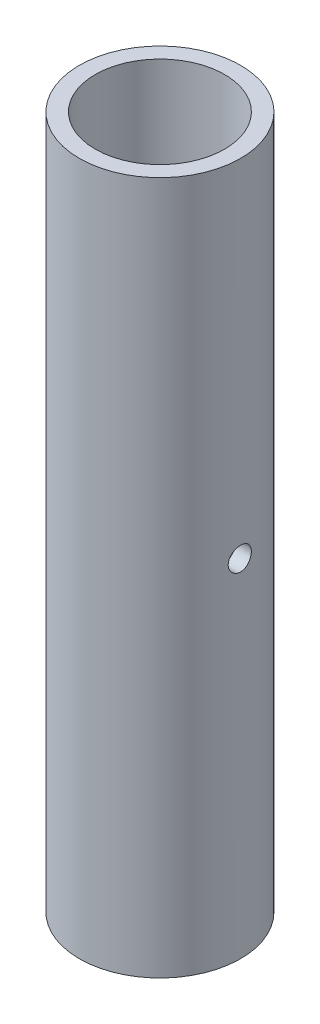
ISO-10303-21;
HEADER;
FILE_DESCRIPTION(('STEP AP214'),'2;1');
FILE_NAME('part.step','',(''),(''),'','','');
FILE_SCHEMA(('AUTOMOTIVE_DESIGN { 1 0 10303 214 1 1 1 1 }'));
ENDSEC;
DATA;
#1=APPLICATION_CONTEXT('core data for automotive mechanical design processes');
#2=APPLICATION_PROTOCOL_DEFINITION('international standard','automotive_design',2000,#1);
#3=PRODUCT_CONTEXT('',#1,'mechanical');
#4=PRODUCT('Part','Part','',(#3));
#5=PRODUCT_RELATED_PRODUCT_CATEGORY('part','',(#4));
#6=PRODUCT_DEFINITION_FORMATION('','',#4);
#7=PRODUCT_DEFINITION_CONTEXT('part definition',#1,'design');
#8=PRODUCT_DEFINITION('design','',#6,#7);
#9=PRODUCT_DEFINITION_SHAPE('','',#8);
#10=(LENGTH_UNIT() NAMED_UNIT(*) SI_UNIT(.MILLI.,.METRE.));
#11=(NAMED_UNIT(*) PLANE_ANGLE_UNIT() SI_UNIT($,.RADIAN.));
#12=(NAMED_UNIT(*) SI_UNIT($,.STERADIAN.) SOLID_ANGLE_UNIT());
#13=UNCERTAINTY_MEASURE_WITH_UNIT(LENGTH_MEASURE(1.E-05),#10,'distance_accuracy_value','');
#14=(GEOMETRIC_REPRESENTATION_CONTEXT(3) GLOBAL_UNCERTAINTY_ASSIGNED_CONTEXT((#13)) GLOBAL_UNIT_ASSIGNED_CONTEXT((#10,
#11,#12)) REPRESENTATION_CONTEXT('',''));
#15=CARTESIAN_POINT('',(0.,0.,0.));
#16=DIRECTION('',(0.,0.,1.));
#17=DIRECTION('',(1.,0.,0.));
#18=AXIS2_PLACEMENT_3D('',#15,#16,#17);
#19=CARTESIAN_POINT('',(0.,-150.,0.));
#20=DIRECTION('',(0.,1.,0.));
#21=DIRECTION('',(0.,0.,1.));
#22=AXIS2_PLACEMENT_3D('',#19,#20,#21);
#23=CYLINDRICAL_SURFACE('',#22,17.45);
#24=CARTESIAN_POINT('',(-17.45,-72.5,0.));
#25=CARTESIAN_POINT('',(-17.449997833609,-72.5000058131986,-0.139659069131431));
#26=CARTESIAN_POINT('',(-17.4483057717418,-72.5117422884323,-0.279400969536089));
#27=CARTESIAN_POINT('',(-17.4417186219199,-72.5583690570464,-0.554983780799083));
#28=CARTESIAN_POINT('',(-17.436820350462,-72.5932823636098,-0.690820674218128));
#29=CARTESIAN_POINT('',(-17.424371627989,-72.6852023949394,-0.954564947499616));
#30=CARTESIAN_POINT('',(-17.4168231194134,-72.7421929417774,-1.08247805438664));
#31=CARTESIAN_POINT('',(-17.3999095852699,-72.8766113042838,-1.32690439029663));
#32=CARTESIAN_POINT('',(-17.3905448289335,-72.9540360914948,-1.44341930508465));
#33=CARTESIAN_POINT('',(-17.3709664886444,-73.1277156880614,-1.66259609430243));
#34=CARTESIAN_POINT('',(-17.3607478606969,-73.2240877178086,-1.76516464040465));
#35=CARTESIAN_POINT('',(-17.3406532956682,-73.432674002354,-1.95273231948699));
#36=CARTESIAN_POINT('',(-17.3307773776495,-73.5448891366372,-2.03773047645087));
#37=CARTESIAN_POINT('',(-17.3124373449939,-73.7825977410483,-2.18810364094725));
#38=CARTESIAN_POINT('',(-17.3039797459275,-73.9081483843782,-2.25338913303157));
#39=CARTESIAN_POINT('',(-17.2895022578095,-74.1685739138452,-2.3619118194634));
#40=CARTESIAN_POINT('',(-17.2834822476269,-74.3034483362663,-2.4051501094291));
#41=CARTESIAN_POINT('',(-17.274610802817,-74.5777146275108,-2.46806285751546));
#42=CARTESIAN_POINT('',(-17.2717379691438,-74.7170692710713,-2.48789652617558));
#43=CARTESIAN_POINT('',(-17.2694210606716,-74.9971562095428,-2.50393008582493));
#44=CARTESIAN_POINT('',(-17.2699768060186,-75.1378884318032,-2.5001312165121));
#45=CARTESIAN_POINT('',(-17.2744346880879,-75.4156153428192,-2.46913781028681));
#46=CARTESIAN_POINT('',(-17.278311541498,-75.5526302213147,-2.44212003198173));
#47=CARTESIAN_POINT('',(-17.2889353425072,-75.8201614996115,-2.36573217987319));
#48=CARTESIAN_POINT('',(-17.2956823647492,-75.9506777303075,-2.31636152474837));
#49=CARTESIAN_POINT('',(-17.3113144307329,-76.2020478782689,-2.19648377630886));
#50=CARTESIAN_POINT('',(-17.320207081256,-76.3228653331845,-2.12590125806105));
#51=CARTESIAN_POINT('',(-17.3391228293591,-76.5510083316402,-1.96565714417655));
#52=CARTESIAN_POINT('',(-17.3491459946886,-76.6583330657717,-1.87599440481316));
#53=CARTESIAN_POINT('',(-17.3693053327107,-76.8574689441922,-1.67916210556575));
#54=CARTESIAN_POINT('',(-17.3794417028889,-76.9491298104439,-1.57184046156676));
#55=CARTESIAN_POINT('',(-17.3986003451384,-77.1131612533287,-1.34325667458432));
#56=CARTESIAN_POINT('',(-17.4076226130734,-77.1855317583446,-1.22199447984781));
#57=CARTESIAN_POINT('',(-17.4235447450989,-77.3089336772925,-0.968845644712525));
#58=CARTESIAN_POINT('',(-17.4304435179015,-77.3599541240174,-0.836953585293477));
#59=CARTESIAN_POINT('',(-17.441332047367,-77.4390802653123,-0.566352842533648));
#60=CARTESIAN_POINT('',(-17.4453219832817,-77.4671873718864,-0.427644579790948));
#61=CARTESIAN_POINT('',(-17.4499196708866,-77.4994905986391,-0.148646527587751));
#62=CARTESIAN_POINT('',(-17.4505566616317,-77.5038934374731,-0.00838113636610004));
#63=CARTESIAN_POINT('',(-17.4484560936687,-77.4892109370226,0.27088581335884));
#64=CARTESIAN_POINT('',(-17.4457186300103,-77.4701262593215,0.409887407348979));
#65=CARTESIAN_POINT('',(-17.4371948404663,-77.4091823291221,0.682059503462008));
#66=CARTESIAN_POINT('',(-17.4314219183416,-77.3674231746923,0.815252874942935));
#67=CARTESIAN_POINT('',(-17.417472688609,-77.2624208098663,1.07274730483414));
#68=CARTESIAN_POINT('',(-17.4092962768242,-77.1991766682044,1.19704797750807));
#69=CARTESIAN_POINT('',(-17.3913767332945,-77.0525102840256,1.4341416626749));
#70=CARTESIAN_POINT('',(-17.3816235077272,-76.9689561669608,1.54685232078545));
#71=CARTESIAN_POINT('',(-17.3616690380562,-76.7842260709651,1.756724996173));
#72=CARTESIAN_POINT('',(-17.3514677703339,-76.6830491622071,1.85388619249818));
#73=CARTESIAN_POINT('',(-17.3316749537202,-76.465027953172,2.03064872982673));
#74=CARTESIAN_POINT('',(-17.3220885907384,-76.3480711122716,2.1101119297161));
#75=CARTESIAN_POINT('',(-17.3047009905486,-76.1023485837484,2.24826429468659));
#76=CARTESIAN_POINT('',(-17.2968997085118,-75.9735831927873,2.30695398147289));
#77=CARTESIAN_POINT('',(-17.2840025230464,-75.7083203280837,2.40167647445549));
#78=CARTESIAN_POINT('',(-17.2788977708991,-75.5718497916312,2.43778345894843));
#79=CARTESIAN_POINT('',(-17.2719475858838,-75.2947036255823,2.48655255471416));
#80=CARTESIAN_POINT('',(-17.2701019493106,-75.1540282593602,2.49921613127768));
#81=CARTESIAN_POINT('',(-17.269886110116,-74.8738417684454,2.50070635732498));
#82=CARTESIAN_POINT('',(-17.2714842483363,-74.7343317741525,2.48975014677459));
#83=CARTESIAN_POINT('',(-17.2779072977888,-74.4591595949335,2.44477554758208));
#84=CARTESIAN_POINT('',(-17.2827322055965,-74.323497405924,2.41075718341443));
#85=CARTESIAN_POINT('',(-17.2950544454013,-74.0599229744012,2.32069823101196));
#86=CARTESIAN_POINT('',(-17.3025500975677,-73.9320059194276,2.26467148322989));
#87=CARTESIAN_POINT('',(-17.3193714878851,-73.6873525193291,2.13220760960368));
#88=CARTESIAN_POINT('',(-17.3286972769633,-73.5706164854722,2.05576991576418));
#89=CARTESIAN_POINT('',(-17.3482304425876,-73.350533509368,1.88386003361371));
#90=CARTESIAN_POINT('',(-17.3584448379142,-73.2473130654026,1.78822668014983));
#91=CARTESIAN_POINT('',(-17.3785447310215,-73.05830683465,1.58098030031121));
#92=CARTESIAN_POINT('',(-17.3884301515271,-72.97252512032,1.46936355169145));
#93=CARTESIAN_POINT('',(-17.4068143220839,-72.8204523822206,1.23266573312442));
#94=CARTESIAN_POINT('',(-17.4153058905528,-72.7542609714361,1.10752012289331));
#95=CARTESIAN_POINT('',(-17.4298747133881,-72.6439338135281,0.847828651271737));
#96=CARTESIAN_POINT('',(-17.4359545023606,-72.5997748991902,0.713292834160892));
#97=CARTESIAN_POINT('',(-17.4436044333333,-72.5449439405054,0.481771497795642));
#98=CARTESIAN_POINT('',(-17.445990637109,-72.5281152725969,0.386224588665812));
#99=CARTESIAN_POINT('',(-17.4491891636135,-72.5056413458888,0.193798407060502));
#100=CARTESIAN_POINT('',(-17.4500015034095,-72.4999959658169,0.0969191490445938));
#101=CARTESIAN_POINT('',(-17.45,-72.5,0.));
#102=B_SPLINE_CURVE_WITH_KNOTS('',3,(#24,#25,#26,#27,#28,#29,#30,#31,#32,#33,#34,#35,#36,#37,
#38,#39,#40,#41,#42,#43,#44,#45,#46,#47,#48,#49,#50,#51,#52,#53,#54,#55,#56,#57,#58,#59,#60,#61,
#62,#63,#64,#65,#66,#67,#68,#69,#70,#71,#72,#73,#74,#75,#76,#77,#78,#79,#80,#81,#82,#83,#84,#85,
#86,#87,#88,#89,#90,#91,#92,#93,#94,#95,#96,#97,#98,#99,#100,#101),.UNSPECIFIED.,.T.,.F.,(4,2,2,
2,2,2,2,2,2,2,2,2,2,2,2,2,2,2,2,2,2,2,2,2,2,2,2,2,2,2,2,2,2,2,2,2,2,2,4),(0.,0.418623095032038,
0.837662480300858,1.25639537779091,1.67506625177178,2.09641379298883,2.51778473332338,
2.9410413026885,3.36427683660441,3.78461639191024,4.204933897545,4.6220797126591,
5.0392363769229,5.45789427521329,5.8765772762085,6.29907548903478,6.72157527039904,
7.14429181797616,7.56698231423851,7.98598059515674,8.4049670742313,8.8221187705194,
9.23928855053353,9.6592430166575,10.0792196474539,10.502367670737,10.9255050663433,
11.347245163796,11.7689589002042,12.1868123067866,12.6046652699271,13.0222558767089,
13.4398581054042,13.8611253415745,14.2824908433322,14.7059634829881,15.1289898969107,
15.4195047512123,15.7100164551299),.UNSPECIFIED.);
#103=CARTESIAN_POINT('',(-17.45,-72.5,0.));
#104=VERTEX_POINT('',#103);
#105=EDGE_CURVE('E10',#104,#104,#102,.T.);
#106=ORIENTED_EDGE('',*,*,#105,.F.);
#107=EDGE_LOOP('',(#106));
#108=FACE_BOUND('',#107,.T.);
#109=CARTESIAN_POINT('',(17.2699884192202,-75.,-2.49999999999999));
#110=CARTESIAN_POINT('',(17.2699906700957,-74.8603492226771,-2.49999417964548));
#111=CARTESIAN_POINT('',(17.2717006294794,-74.7206155911987,-2.48825905096343));
#112=CARTESIAN_POINT('',(17.2783516696973,-74.4450499575135,-2.44163811644041));
#113=CARTESIAN_POINT('',(17.2832959665398,-74.3092219793099,-2.40672926769443));
#114=CARTESIAN_POINT('',(17.2958444371735,-74.0454965676647,-2.3148222739143));
#115=CARTESIAN_POINT('',(17.3034466370928,-73.9175933317241,-2.25784051778013));
#116=CARTESIAN_POINT('',(17.3204519870499,-73.6731835725247,-2.12344286428691));
#117=CARTESIAN_POINT('',(17.3298548719862,-73.5566753754678,-2.04602997421969));
#118=CARTESIAN_POINT('',(17.349479042744,-73.3374911544214,-1.87236246009536));
#119=CARTESIAN_POINT('',(17.3597052775671,-73.234910550387,-1.77598795200909));
#120=CARTESIAN_POINT('',(17.3797796495088,-73.0473195552472,-1.5673916274996));
#121=CARTESIAN_POINT('',(17.3896277663983,-72.9623101031228,-1.45516896470933));
#122=CARTESIAN_POINT('',(17.4078877863405,-72.8119250046668,-1.21745361153158));
#123=CARTESIAN_POINT('',(17.4162932212316,-72.746636832864,-1.09190504324199));
#124=CARTESIAN_POINT('',(17.4306661084296,-72.638108621911,-0.831484018550039));
#125=CARTESIAN_POINT('',(17.4366336784989,-72.5948675177384,-0.696612012890182));
#126=CARTESIAN_POINT('',(17.4454235522337,-72.5319490696576,-0.422353743869612));
#127=CARTESIAN_POINT('',(17.4482671389467,-72.5121122081058,-0.283004769062727));
#128=CARTESIAN_POINT('',(17.4505615218279,-72.4960702978731,-0.00292897602710538));
#129=CARTESIAN_POINT('',(17.4500124908175,-72.499864045439,0.137797771652678));
#130=CARTESIAN_POINT('',(17.4456005650384,-72.5308492191301,0.415546937899434));
#131=CARTESIAN_POINT('',(17.4417619746957,-72.5578690472423,0.552588940348131));
#132=CARTESIAN_POINT('',(17.4312293445286,-72.6342703528771,0.820173403317914));
#133=CARTESIAN_POINT('',(17.424535236532,-72.6836523642733,0.950715708582967));
#134=CARTESIAN_POINT('',(17.4090018733181,-72.8035538768377,1.2021179425556));
#135=CARTESIAN_POINT('',(17.4001552485319,-72.8741461950072,1.32294266871781));
#136=CARTESIAN_POINT('',(17.381303911319,-73.0344113601721,1.55109607858851));
#137=CARTESIAN_POINT('',(17.3712991292824,-73.1240853543255,1.65842395027141));
#138=CARTESIAN_POINT('',(17.3511423946113,-73.3209257939086,1.8575475802696));
#139=CARTESIAN_POINT('',(17.3409899269637,-73.4282419870359,1.94919531865311));
#140=CARTESIAN_POINT('',(17.3217699334829,-73.6568101356806,2.11320284902101));
#141=CARTESIAN_POINT('',(17.3127024132685,-73.7780621633624,2.185562541119));
#142=CARTESIAN_POINT('',(17.2966792278577,-74.0312079218042,2.30895661523193));
#143=CARTESIAN_POINT('',(17.2897249744946,-74.1631086926491,2.3599767492233));
#144=CARTESIAN_POINT('',(17.2787413803952,-74.433728418079,2.43909961050928));
#145=CARTESIAN_POINT('',(17.274711852449,-74.5724469356573,2.46720380465314));
#146=CARTESIAN_POINT('',(17.270069125874,-74.8514502631586,2.49949601568935));
#147=CARTESIAN_POINT('',(17.269426017722,-74.9917103578998,2.50389342382887));
#148=CARTESIAN_POINT('',(17.2715496287525,-75.2709654223813,2.48920195223854));
#149=CARTESIAN_POINT('',(17.2743162517158,-75.4099604277096,2.47011373524991));
#150=CARTESIAN_POINT('',(17.2829201759858,-75.6820971574635,2.40917008643165));
#151=CARTESIAN_POINT('',(17.2887435169935,-75.8152625350838,2.36741813253414));
#152=CARTESIAN_POINT('',(17.3027932836378,-76.0727041506614,2.26243951038765));
#153=CARTESIAN_POINT('',(17.3110198182981,-76.1969799850159,2.19921186784844));
#154=CARTESIAN_POINT('',(17.3290198614878,-76.4340559248456,2.05257022421394));
#155=CARTESIAN_POINT('',(17.3388036359795,-76.5467710827543,1.96902016971504));
#156=CARTESIAN_POINT('',(17.3587844941479,-76.7566547207222,1.78429542601091));
#157=CARTESIAN_POINT('',(17.3689815990636,-76.8538224006013,1.68311983023358));
#158=CARTESIAN_POINT('',(17.388733193526,-77.0306001258364,1.46509597037584));
#159=CARTESIAN_POINT('',(17.3982822360595,-77.1100717377769,1.34813489628502));
#160=CARTESIAN_POINT('',(17.4155780950753,-77.2482388464355,1.10240154531827));
#161=CARTESIAN_POINT('',(17.4233249572759,-77.306934870215,0.97362956818058));
#162=CARTESIAN_POINT('',(17.4361196462015,-77.4016613105041,0.708369910739485));
#163=CARTESIAN_POINT('',(17.4411766237855,-77.4377686474631,0.571910159295786));
#164=CARTESIAN_POINT('',(17.4480600592334,-77.4865420983606,0.294786834398611));
#165=CARTESIAN_POINT('',(17.4498867109459,-77.4992096189012,0.154123513712312));
#166=CARTESIAN_POINT('',(17.4501020348807,-77.5007118298357,-0.126068842496563));
#167=CARTESIAN_POINT('',(17.4485213287242,-77.4897587956624,-0.26559676319046));
#168=CARTESIAN_POINT('',(17.4421610263954,-77.444784263737,-0.540805614619161));
#169=CARTESIAN_POINT('',(17.4373814379203,-77.4107628214928,-0.67648655460986));
#170=CARTESIAN_POINT('',(17.4251578684848,-77.3206901168992,-0.940100311878788));
#171=CARTESIAN_POINT('',(17.4177155107067,-77.2646522733652,-1.06803779401929));
#172=CARTESIAN_POINT('',(17.4009857409017,-77.1321598490916,-1.31272745268779));
#173=CARTESIAN_POINT('',(17.3916982796454,-77.0557047235773,-1.4294793306481));
#174=CARTESIAN_POINT('',(17.372212619974,-76.8837750931561,-1.64956275965084));
#175=CARTESIAN_POINT('',(17.3620073087598,-76.7881434454098,-1.75277093088839));
#176=CARTESIAN_POINT('',(17.3418900445272,-76.5809056036347,-1.94175319343923));
#177=CARTESIAN_POINT('',(17.3319781610562,-76.4692956584833,-2.02752317942601));
#178=CARTESIAN_POINT('',(17.3135159357748,-76.2326039402654,-2.17958261066715));
#179=CARTESIAN_POINT('',(17.3049727931516,-76.1074563847919,-2.24577050884667));
#180=CARTESIAN_POINT('',(17.290299637642,-75.8477609149351,-2.35609056867585));
#181=CARTESIAN_POINT('',(17.2841670872327,-75.7132230619837,-2.40024593625506));
#182=CARTESIAN_POINT('',(17.276447204345,-75.4817111041726,-2.45506739474629));
#183=CARTESIAN_POINT('',(17.2740377744681,-75.3861762705819,-2.47189179342364));
#184=CARTESIAN_POINT('',(17.2708076098865,-75.193774246926,-2.4943600525109));
#185=CARTESIAN_POINT('',(17.269986857283,-75.0969070718841,-2.50000403888558));
#186=CARTESIAN_POINT('',(17.2699884192202,-75.,-2.49999999999999));
#187=B_SPLINE_CURVE_WITH_KNOTS('',3,(#109,#110,#111,#112,#113,#114,#115,#116,#117,#118,#119,
#120,#121,#122,#123,#124,#125,#126,#127,#128,#129,#130,#131,#132,#133,#134,#135,#136,#137,#138,
#139,#140,#141,#142,#143,#144,#145,#146,#147,#148,#149,#150,#151,#152,#153,#154,#155,#156,#157,
#158,#159,#160,#161,#162,#163,#164,#165,#166,#167,#168,#169,#170,#171,#172,#173,#174,#175,#176,
#177,#178,#179,#180,#181,#182,#183,#184,#185,#186),.UNSPECIFIED.,.T.,.F.,(4,2,2,2,2,2,2,2,2,2,2,
2,2,2,2,2,2,2,2,2,2,2,2,2,2,2,2,2,2,2,2,2,2,2,2,2,2,2,4),(0.,0.418598182334522,
0.837613224602607,1.2563177471328,1.67496067420169,2.09634082539992,2.51774348882405,
2.94098874445322,3.36421355253941,3.7845367858765,4.20483860794369,4.62206160336464,
5.03929456007134,5.45797660961437,5.87668383673078,6.29914833494594,6.72161502092217,
7.14436333144331,7.56708457972131,7.98606593142512,8.40503546015904,8.82210795656637,
9.23919937688138,9.65916392960754,10.0791500896482,10.5023145282642,10.9254682307419,
11.3471730254977,11.7688525133091,12.1867582143751,12.6046629098682,13.0223132900462,
13.4399748151014,13.8612100865011,14.2825444112704,14.7060268257321,15.1290622576303,
15.4195409929497,15.7100164555549),.UNSPECIFIED.);
#188=CARTESIAN_POINT('',(17.2699884192202,-75.,-2.49999999999999));
#189=VERTEX_POINT('',#188);
#190=EDGE_CURVE('E48',#189,#189,#187,.T.);
#191=ORIENTED_EDGE('',*,*,#190,.F.);
#192=EDGE_LOOP('',(#191));
#193=FACE_BOUND('',#192,.T.);
#194=CARTESIAN_POINT('',(0.,-150.,0.));
#195=DIRECTION('',(0.,1.,0.));
#196=DIRECTION('',(0.,0.,1.));
#197=AXIS2_PLACEMENT_3D('',#194,#195,#196);
#198=CIRCLE('',#197,17.45);
#199=CARTESIAN_POINT('',(0.,-150.,17.45));
#200=VERTEX_POINT('',#199);
#201=EDGE_CURVE('E52',#200,#200,#198,.T.);
#202=ORIENTED_EDGE('',*,*,#201,.T.);
#203=EDGE_LOOP('',(#202));
#204=FACE_BOUND('',#203,.T.);
#205=CARTESIAN_POINT('',(0.,0.,0.));
#206=DIRECTION('',(0.,1.,0.));
#207=DIRECTION('',(0.,0.,1.));
#208=AXIS2_PLACEMENT_3D('',#205,#206,#207);
#209=CIRCLE('',#208,17.45);
#210=CARTESIAN_POINT('',(0.,0.,17.45));
#211=VERTEX_POINT('',#210);
#212=EDGE_CURVE('E56',#211,#211,#209,.T.);
#213=ORIENTED_EDGE('',*,*,#212,.F.);
#214=EDGE_LOOP('',(#213));
#215=FACE_BOUND('',#214,.T.);
#216=ADVANCED_FACE('F37',(#108,#193,#204,#215),#23,.T.);
#217=CARTESIAN_POINT('',(0.,-150.,0.));
#218=DIRECTION('',(0.,1.,0.));
#219=DIRECTION('',(0.,0.,1.));
#220=AXIS2_PLACEMENT_3D('',#217,#218,#219);
#221=PLANE('',#220);
#222=CARTESIAN_POINT('',(0.,-150.,0.));
#223=DIRECTION('',(0.,1.,0.));
#224=DIRECTION('',(0.,0.,1.));
#225=AXIS2_PLACEMENT_3D('',#222,#223,#224);
#226=CIRCLE('',#225,14.);
#227=CARTESIAN_POINT('',(0.,-150.,14.));
#228=VERTEX_POINT('',#227);
#229=EDGE_CURVE('E87',#228,#228,#226,.T.);
#230=ORIENTED_EDGE('',*,*,#229,.T.);
#231=EDGE_LOOP('',(#230));
#232=FACE_BOUND('',#231,.T.);
#233=ORIENTED_EDGE('',*,*,#201,.F.);
#234=EDGE_LOOP('',(#233));
#235=FACE_BOUND('',#234,.T.);
#236=ADVANCED_FACE('F97',(#232,#235),#221,.F.);
#237=CARTESIAN_POINT('',(0.,0.,0.));
#238=DIRECTION('',(0.,1.,0.));
#239=DIRECTION('',(0.,0.,1.));
#240=AXIS2_PLACEMENT_3D('',#237,#238,#239);
#241=PLANE('',#240);
#242=CARTESIAN_POINT('',(0.,0.,0.));
#243=DIRECTION('',(0.,1.,0.));
#244=DIRECTION('',(0.,0.,1.));
#245=AXIS2_PLACEMENT_3D('',#242,#243,#244);
#246=CIRCLE('',#245,14.);
#247=CARTESIAN_POINT('',(0.,0.,14.));
#248=VERTEX_POINT('',#247);
#249=EDGE_CURVE('E86',#248,#248,#246,.T.);
#250=ORIENTED_EDGE('',*,*,#249,.F.);
#251=EDGE_LOOP('',(#250));
#252=FACE_BOUND('',#251,.T.);
#253=ORIENTED_EDGE('',*,*,#212,.T.);
#254=EDGE_LOOP('',(#253));
#255=FACE_BOUND('',#254,.T.);
#256=ADVANCED_FACE('F94',(#252,#255),#241,.T.);
#257=CARTESIAN_POINT('',(0.,-150.,0.));
#258=DIRECTION('',(0.,1.,0.));
#259=DIRECTION('',(0.,0.,1.));
#260=AXIS2_PLACEMENT_3D('',#257,#258,#259);
#261=CYLINDRICAL_SURFACE('',#260,14.);
#262=CARTESIAN_POINT('',(-13.7749773139559,-75.,-2.49999999999999));
#263=CARTESIAN_POINT('',(-13.7749799387038,-75.1392196330124,-2.4999945411629));
#264=CARTESIAN_POINT('',(-13.7771107908789,-75.2785115418703,-2.4883313115394));
#265=CARTESIAN_POINT('',(-13.7853946199968,-75.5531762654139,-2.44201304135069));
#266=CARTESIAN_POINT('',(-13.7915511402329,-75.6885455177565,-2.40733774573405));
#267=CARTESIAN_POINT('',(-13.8071672988197,-75.9513506606361,-2.31608691728921));
#268=CARTESIAN_POINT('',(-13.8166239998033,-76.0787934877299,-2.25953085486462));
#269=CARTESIAN_POINT('',(-13.8377715156682,-76.3223710878122,-2.12617418313793));
#270=CARTESIAN_POINT('',(-13.8494621222548,-76.4385069135703,-2.04937546105771));
#271=CARTESIAN_POINT('',(-13.873907770039,-76.6574969277784,-1.87678833540927));
#272=CARTESIAN_POINT('',(-13.8866723857643,-76.7602048170653,-1.78081562712205));
#273=CARTESIAN_POINT('',(-13.9117430255489,-76.9481505289256,-1.57300318552242));
#274=CARTESIAN_POINT('',(-13.9240490207841,-77.0333872549515,-1.46116245702622));
#275=CARTESIAN_POINT('',(-13.9469179106052,-77.184526710267,-1.22383338523176));
#276=CARTESIAN_POINT('',(-13.9574682193538,-77.2502922711374,-1.09825637183169));
#277=CARTESIAN_POINT('',(-13.9755301011882,-77.3597397426855,-0.837616772802046));
#278=CARTESIAN_POINT('',(-13.9830419008821,-77.4034233002707,-0.702554895423173));
#279=CARTESIAN_POINT('',(-13.9941127759412,-77.4670164900452,-0.428293673644151));
#280=CARTESIAN_POINT('',(-13.997712773247,-77.4871724170435,-0.289153116844079));
#281=CARTESIAN_POINT('',(-14.0006952718093,-77.5039049272463,-0.00942173772766606));
#282=CARTESIAN_POINT('',(-14.0000781001693,-77.5004833392333,0.131168971263464));
#283=CARTESIAN_POINT('',(-13.9947279617152,-77.4703482458033,0.408122988432867));
#284=CARTESIAN_POINT('',(-13.9900418473477,-77.4438998764014,0.54451618105207));
#285=CARTESIAN_POINT('',(-13.9771327520065,-77.3688805120892,0.810897015102348));
#286=CARTESIAN_POINT('',(-13.9689096512162,-77.3203087677388,0.940884439369614));
#287=CARTESIAN_POINT('',(-13.9497715520927,-77.2021640140837,1.19154151829012));
#288=CARTESIAN_POINT('',(-13.9388428375475,-77.1324835779178,1.31215944836134));
#289=CARTESIAN_POINT('',(-13.9155046200703,-76.9741783610612,1.54009014093527));
#290=CARTESIAN_POINT('',(-13.9030949801311,-76.8855518269774,1.64740167052528));
#291=CARTESIAN_POINT('',(-13.8779680889456,-76.6904048880118,1.84724240926311));
#292=CARTESIAN_POINT('',(-13.8652489602259,-76.5836526121622,1.939545099914));
#293=CARTESIAN_POINT('',(-13.8411025662894,-76.3560607918269,2.10496786240999));
#294=CARTESIAN_POINT('',(-13.8296753166704,-76.2352210772891,2.17808770266066));
#295=CARTESIAN_POINT('',(-13.8094045266784,-75.9826009521027,2.30312479829603));
#296=CARTESIAN_POINT('',(-13.8005646973667,-75.8508051717537,2.3550116418329));
#297=CARTESIAN_POINT('',(-13.7865283348087,-75.5801741875886,2.43584403060096));
#298=CARTESIAN_POINT('',(-13.7813314298779,-75.4413397034759,2.46479191631385));
#299=CARTESIAN_POINT('',(-13.7752421770154,-75.1626079045588,2.49859916205465));
#300=CARTESIAN_POINT('',(-13.7742918793935,-75.0227511530501,2.50378283673312));
#301=CARTESIAN_POINT('',(-13.776648684601,-74.7441696629841,2.49078161816557));
#302=CARTESIAN_POINT('',(-13.7799555974406,-74.605444874188,2.47259776776006));
#303=CARTESIAN_POINT('',(-13.7904004323731,-74.3341154177316,2.4136552586584));
#304=CARTESIAN_POINT('',(-13.7975098617234,-74.201473097393,2.37306442666376));
#305=CARTESIAN_POINT('',(-13.8147344144981,-73.944872687796,2.27063733511701));
#306=CARTESIAN_POINT('',(-13.824849741264,-73.8209151867448,2.2087996382238));
#307=CARTESIAN_POINT('',(-13.847079502443,-73.5837678735323,2.06487935022983));
#308=CARTESIAN_POINT('',(-13.8592138527616,-73.4707050915306,1.98259057596103));
#309=CARTESIAN_POINT('',(-13.8840574336727,-73.2598757448343,1.80038422344423));
#310=CARTESIAN_POINT('',(-13.896766710884,-73.1621104234329,1.70046521371051));
#311=CARTESIAN_POINT('',(-13.9215130679047,-72.9834516852837,1.48439134339207));
#312=CARTESIAN_POINT('',(-13.9335402120035,-72.9027755803848,1.36805548621628));
#313=CARTESIAN_POINT('',(-13.9554035273845,-72.7621139375779,1.12329296566844));
#314=CARTESIAN_POINT('',(-13.9652397773074,-72.7021276569784,0.99486673650867));
#315=CARTESIAN_POINT('',(-13.9815700956849,-72.6048794814426,0.730189348324153));
#316=CARTESIAN_POINT('',(-13.9880802890981,-72.5675077834215,0.593979571421839));
#317=CARTESIAN_POINT('',(-13.9970934930076,-72.51619771652,0.317090343286907));
#318=CARTESIAN_POINT('',(-13.9995968842815,-72.5022571209094,0.176411318075566));
#319=CARTESIAN_POINT('',(-14.0003078168069,-72.4982765730531,-0.103333169371399));
#320=CARTESIAN_POINT('',(-13.9985745411226,-72.5079073488639,-0.242393904292875));
#321=CARTESIAN_POINT('',(-13.9911289095657,-72.5500789667388,-0.51688255605543));
#322=CARTESIAN_POINT('',(-13.9854165844658,-72.5826196316261,-0.652310500982776));
#323=CARTESIAN_POINT('',(-13.9706535216891,-72.669553936971,-0.915536497496656));
#324=CARTESIAN_POINT('',(-13.9616076667541,-72.7239156257277,-1.04334539246557));
#325=CARTESIAN_POINT('',(-13.9411603934573,-72.8529106931105,-1.28807790386464));
#326=CARTESIAN_POINT('',(-13.9297588372901,-72.9275452577534,-1.40500088290236));
#327=CARTESIAN_POINT('',(-13.9056730650892,-73.0961159887127,-1.62629147773911));
#328=CARTESIAN_POINT('',(-13.892974041367,-73.190291518827,-1.73047516435832));
#329=CARTESIAN_POINT('',(-13.8678219751628,-73.3947713719641,-1.92167550896122));
#330=CARTESIAN_POINT('',(-13.8553689910715,-73.5050794726303,-2.00868813488379));
#331=CARTESIAN_POINT('',(-13.8320070537405,-73.7397811611838,-2.1637462241578));
#332=CARTESIAN_POINT('',(-13.8211117157455,-73.8642836526196,-2.23162894316816));
#333=CARTESIAN_POINT('',(-13.8022610834653,-74.1230750676556,-2.34540886935922));
#334=CARTESIAN_POINT('',(-13.7943029436204,-74.2573543676377,-2.39132736832843));
#335=CARTESIAN_POINT('',(-13.7839341813702,-74.4934067352134,-2.45025798781185));
#336=CARTESIAN_POINT('',(-13.7805947327216,-74.5937758659115,-2.46888019081667));
#337=CARTESIAN_POINT('',(-13.7761153629215,-74.7960837619679,-2.49375305438022));
#338=CARTESIAN_POINT('',(-13.7749753913445,-74.8980224912874,-2.50000399856394));
#339=CARTESIAN_POINT('',(-13.7749773139559,-75.,-2.49999999999999));
#340=B_SPLINE_CURVE_WITH_KNOTS('',3,(#262,#263,#264,#265,#266,#267,#268,#269,#270,#271,#272,
#273,#274,#275,#276,#277,#278,#279,#280,#281,#282,#283,#284,#285,#286,#287,#288,#289,#290,#291,
#292,#293,#294,#295,#296,#297,#298,#299,#300,#301,#302,#303,#304,#305,#306,#307,#308,#309,#310,
#311,#312,#313,#314,#315,#316,#317,#318,#319,#320,#321,#322,#323,#324,#325,#326,#327,#328,#329,
#330,#331,#332,#333,#334,#335,#336,#337,#338,#339),.UNSPECIFIED.,.T.,.F.,(4,2,2,2,2,2,2,2,2,2,2,
2,2,2,2,2,2,2,2,2,2,2,2,2,2,2,2,2,2,2,2,2,2,2,2,2,2,2,4),(0.,0.417285836009316,0.83493945195107,
1.25222227420762,1.66946620696474,2.09093251520213,2.51242526794799,2.93682027279776,
3.36118362098867,3.78106358503934,4.20091098159993,4.61598714610603,5.03107737256275,
5.44831662439173,5.86559450693786,6.28867984623348,6.71177029320066,7.13546462585334,
7.55911572303871,7.97696761802823,8.39480086586729,8.80954621973381,9.22431963646749,
9.64345757488931,10.0626295608598,10.4868484189541,10.9110520475064,11.333179112111,
11.7552660584073,12.1714905473979,12.5877118174953,13.003325840844,13.4189641839515,
13.8400311188066,14.2611968100938,14.6858441972247,15.110079099029,15.4157453666601,
15.7214046264677),.UNSPECIFIED.);
#341=CARTESIAN_POINT('',(-13.7749773139559,-75.,-2.49999999999999));
#342=VERTEX_POINT('',#341);
#343=EDGE_CURVE('E80',#342,#342,#340,.T.);
#344=ORIENTED_EDGE('',*,*,#343,.T.);
#345=EDGE_LOOP('',(#344));
#346=FACE_BOUND('',#345,.T.);
#347=CARTESIAN_POINT('',(13.7749773139559,-75.,-2.49999999999999));
#348=CARTESIAN_POINT('',(13.7749799387038,-74.8607803669876,-2.4999945411629));
#349=CARTESIAN_POINT('',(13.7771107908789,-74.7214884581297,-2.48833131153941));
#350=CARTESIAN_POINT('',(13.7853946199968,-74.4468237345861,-2.4420130413507));
#351=CARTESIAN_POINT('',(13.7915511402329,-74.3114544822435,-2.40733774573405));
#352=CARTESIAN_POINT('',(13.8071672988197,-74.0486493393639,-2.31608691728921));
#353=CARTESIAN_POINT('',(13.8166239998033,-73.9212065122701,-2.25953085486462));
#354=CARTESIAN_POINT('',(13.8377715156682,-73.6776289121878,-2.12617418313793));
#355=CARTESIAN_POINT('',(13.8494621222548,-73.5614930864297,-2.04937546105771));
#356=CARTESIAN_POINT('',(13.873907770039,-73.3425030722216,-1.87678833540927));
#357=CARTESIAN_POINT('',(13.8866723857643,-73.2397951829347,-1.78081562712205));
#358=CARTESIAN_POINT('',(13.9117430255489,-73.0518494710744,-1.57300318552242));
#359=CARTESIAN_POINT('',(13.9240490207841,-72.9666127450485,-1.46116245702622));
#360=CARTESIAN_POINT('',(13.9469179106052,-72.815473289733,-1.22383338523176));
#361=CARTESIAN_POINT('',(13.9574682193538,-72.7497077288626,-1.09825637183169));
#362=CARTESIAN_POINT('',(13.9755301011882,-72.6402602573145,-0.837616772802046));
#363=CARTESIAN_POINT('',(13.9830419008821,-72.5965766997293,-0.702554895423173));
#364=CARTESIAN_POINT('',(13.9941127759412,-72.5329835099548,-0.42829367364415));
#365=CARTESIAN_POINT('',(13.997712773247,-72.5128275829565,-0.289153116844077));
#366=CARTESIAN_POINT('',(14.0006952718093,-72.4960950727537,-0.00942173772766448));
#367=CARTESIAN_POINT('',(14.0000781001693,-72.4995166607667,0.131168971263465));
#368=CARTESIAN_POINT('',(13.9947279617152,-72.5296517541967,0.408122988432867));
#369=CARTESIAN_POINT('',(13.9900418473477,-72.5561001235986,0.54451618105207));
#370=CARTESIAN_POINT('',(13.9771327520065,-72.6311194879108,0.810897015102348));
#371=CARTESIAN_POINT('',(13.9689096512162,-72.6796912322612,0.940884439369613));
#372=CARTESIAN_POINT('',(13.9497715520927,-72.7978359859163,1.19154151829012));
#373=CARTESIAN_POINT('',(13.9388428375475,-72.8675164220822,1.31215944836134));
#374=CARTESIAN_POINT('',(13.9155046200703,-73.0258216389388,1.54009014093528));
#375=CARTESIAN_POINT('',(13.9030949801311,-73.1144481730226,1.64740167052528));
#376=CARTESIAN_POINT('',(13.8779680889456,-73.3095951119882,1.84724240926311));
#377=CARTESIAN_POINT('',(13.8652489602259,-73.4163473878378,1.939545099914));
#378=CARTESIAN_POINT('',(13.8411025662894,-73.6439392081731,2.10496786240999));
#379=CARTESIAN_POINT('',(13.8296753166704,-73.7647789227109,2.17808770266066));
#380=CARTESIAN_POINT('',(13.8094045266784,-74.0173990478973,2.30312479829603));
#381=CARTESIAN_POINT('',(13.8005646973667,-74.1491948282463,2.3550116418329));
#382=CARTESIAN_POINT('',(13.7865283348087,-74.4198258124114,2.43584403060096));
#383=CARTESIAN_POINT('',(13.7813314298779,-74.5586602965241,2.46479191631385));
#384=CARTESIAN_POINT('',(13.7752421770154,-74.8373920954412,2.49859916205465));
#385=CARTESIAN_POINT('',(13.7742918793935,-74.9772488469499,2.50378283673312));
#386=CARTESIAN_POINT('',(13.776648684601,-75.2558303370159,2.49078161816557));
#387=CARTESIAN_POINT('',(13.7799555974406,-75.394555125812,2.47259776776006));
#388=CARTESIAN_POINT('',(13.7904004323731,-75.6658845822684,2.4136552586584));
#389=CARTESIAN_POINT('',(13.7975098617234,-75.798526902607,2.37306442666376));
#390=CARTESIAN_POINT('',(13.8147344144981,-76.055127312204,2.27063733511701));
#391=CARTESIAN_POINT('',(13.824849741264,-76.1790848132552,2.2087996382238));
#392=CARTESIAN_POINT('',(13.847079502443,-76.4162321264677,2.06487935022983));
#393=CARTESIAN_POINT('',(13.8592138527616,-76.5292949084694,1.98259057596103));
#394=CARTESIAN_POINT('',(13.8840574336727,-76.7401242551657,1.80038422344423));
#395=CARTESIAN_POINT('',(13.896766710884,-76.8378895765671,1.70046521371051));
#396=CARTESIAN_POINT('',(13.9215130679047,-77.0165483147163,1.48439134339207));
#397=CARTESIAN_POINT('',(13.9335402120035,-77.0972244196152,1.36805548621628));
#398=CARTESIAN_POINT('',(13.9554035273845,-77.2378860624221,1.12329296566844));
#399=CARTESIAN_POINT('',(13.9652397773074,-77.2978723430216,0.99486673650867));
#400=CARTESIAN_POINT('',(13.9815700956849,-77.3951205185574,0.730189348324153));
#401=CARTESIAN_POINT('',(13.9880802890981,-77.4324922165785,0.593979571421839));
#402=CARTESIAN_POINT('',(13.9970934930076,-77.48380228348,0.317090343286907));
#403=CARTESIAN_POINT('',(13.9995968842815,-77.4977428790905,0.176411318075566));
#404=CARTESIAN_POINT('',(14.0003078168069,-77.5017234269469,-0.103333169371399));
#405=CARTESIAN_POINT('',(13.9985745411226,-77.4920926511361,-0.242393904292875));
#406=CARTESIAN_POINT('',(13.9911289095657,-77.4499210332612,-0.51688255605543));
#407=CARTESIAN_POINT('',(13.9854165844658,-77.4173803683739,-0.652310500982776));
#408=CARTESIAN_POINT('',(13.9706535216891,-77.330446063029,-0.915536497496658));
#409=CARTESIAN_POINT('',(13.9616076667541,-77.2760843742722,-1.04334539246558));
#410=CARTESIAN_POINT('',(13.9411603934573,-77.1470893068895,-1.28807790386464));
#411=CARTESIAN_POINT('',(13.9297588372901,-77.0724547422466,-1.40500088290236));
#412=CARTESIAN_POINT('',(13.9056730650892,-76.9038840112873,-1.6262914777391));
#413=CARTESIAN_POINT('',(13.892974041367,-76.809708481173,-1.73047516435831));
#414=CARTESIAN_POINT('',(13.8678219751628,-76.6052286280359,-1.92167550896121));
#415=CARTESIAN_POINT('',(13.8553689910715,-76.4949205273697,-2.00868813488378));
#416=CARTESIAN_POINT('',(13.8320070537405,-76.2602188388161,-2.1637462241578));
#417=CARTESIAN_POINT('',(13.8211117157455,-76.1357163473804,-2.23162894316816));
#418=CARTESIAN_POINT('',(13.8022610834653,-75.8769249323444,-2.34540886935922));
#419=CARTESIAN_POINT('',(13.7943029436204,-75.7426456323623,-2.39132736832843));
#420=CARTESIAN_POINT('',(13.7839341813702,-75.5065932647866,-2.45025798781185));
#421=CARTESIAN_POINT('',(13.7805947327216,-75.4062241340885,-2.46888019081667));
#422=CARTESIAN_POINT('',(13.7761153629215,-75.2039162380321,-2.49375305438022));
#423=CARTESIAN_POINT('',(13.7749753913445,-75.1019775087126,-2.50000399856394));
#424=CARTESIAN_POINT('',(13.7749773139559,-75.,-2.49999999999999));
#425=B_SPLINE_CURVE_WITH_KNOTS('',3,(#347,#348,#349,#350,#351,#352,#353,#354,#355,#356,#357,
#358,#359,#360,#361,#362,#363,#364,#365,#366,#367,#368,#369,#370,#371,#372,#373,#374,#375,#376,
#377,#378,#379,#380,#381,#382,#383,#384,#385,#386,#387,#388,#389,#390,#391,#392,#393,#394,#395,
#396,#397,#398,#399,#400,#401,#402,#403,#404,#405,#406,#407,#408,#409,#410,#411,#412,#413,#414,
#415,#416,#417,#418,#419,#420,#421,#422,#423,#424),.UNSPECIFIED.,.T.,.F.,(4,2,2,2,2,2,2,2,2,2,2,
2,2,2,2,2,2,2,2,2,2,2,2,2,2,2,2,2,2,2,2,2,2,2,2,2,2,2,4),(0.,0.417285836009302,0.83493945195107,
1.25222227420762,1.66946620696474,2.09093251520213,2.51242526794799,2.93682027279776,
3.36118362098867,3.78106358503934,4.20091098159993,4.61598714610603,5.03107737256275,
5.44831662439173,5.86559450693786,6.28867984623348,6.71177029320066,7.13546462585334,
7.55911572303871,7.97696761802823,8.39480086586729,8.80954621973381,9.2243196364675,
9.64345757488931,10.0626295608598,10.4868484189541,10.9110520475064,11.333179112111,
11.7552660584073,12.1714905473979,12.5877118174953,13.003325840844,13.4189641839515,
13.8400311188066,14.2611968100938,14.6858441972248,15.110079099029,15.4157453666601,
15.7214046264677),.UNSPECIFIED.);
#426=CARTESIAN_POINT('',(13.7749773139559,-75.,-2.49999999999999));
#427=VERTEX_POINT('',#426);
#428=EDGE_CURVE('E75',#427,#427,#425,.T.);
#429=ORIENTED_EDGE('',*,*,#428,.T.);
#430=EDGE_LOOP('',(#429));
#431=FACE_BOUND('',#430,.T.);
#432=ORIENTED_EDGE('',*,*,#229,.F.);
#433=EDGE_LOOP('',(#432));
#434=FACE_BOUND('',#433,.T.);
#435=ORIENTED_EDGE('',*,*,#249,.T.);
#436=EDGE_LOOP('',(#435));
#437=FACE_BOUND('',#436,.T.);
#438=ADVANCED_FACE('F67',(#346,#431,#434,#437),#261,.F.);
#439=CARTESIAN_POINT('',(17.45,-75.,0.));
#440=DIRECTION('',(1.,0.,0.));
#441=DIRECTION('',(0.,0.,-1.));
#442=AXIS2_PLACEMENT_3D('',#439,#440,#441);
#443=CYLINDRICAL_SURFACE('',#442,2.49999999999999);
#444=ORIENTED_EDGE('',*,*,#190,.T.);
#445=EDGE_LOOP('',(#444));
#446=FACE_BOUND('',#445,.T.);
#447=ORIENTED_EDGE('',*,*,#428,.F.);
#448=EDGE_LOOP('',(#447));
#449=FACE_BOUND('',#448,.T.);
#450=ADVANCED_FACE('F66',(#446,#449),#443,.F.);
#451=ORIENTED_EDGE('',*,*,#105,.T.);
#452=EDGE_LOOP('',(#451));
#453=FACE_BOUND('',#452,.T.);
#454=ORIENTED_EDGE('',*,*,#343,.F.);
#455=EDGE_LOOP('',(#454));
#456=FACE_BOUND('',#455,.T.);
#457=ADVANCED_FACE('F62',(#453,#456),#443,.F.);
#458=CLOSED_SHELL('',(#216,#236,#256,#438,#450,#457));
#459=MANIFOLD_SOLID_BREP('B2',#458);
#460=ADVANCED_BREP_SHAPE_REPRESENTATION('',(#18,#459),#14);
#461=SHAPE_DEFINITION_REPRESENTATION(#9,#460);
ENDSEC;
END-ISO-10303-21;
